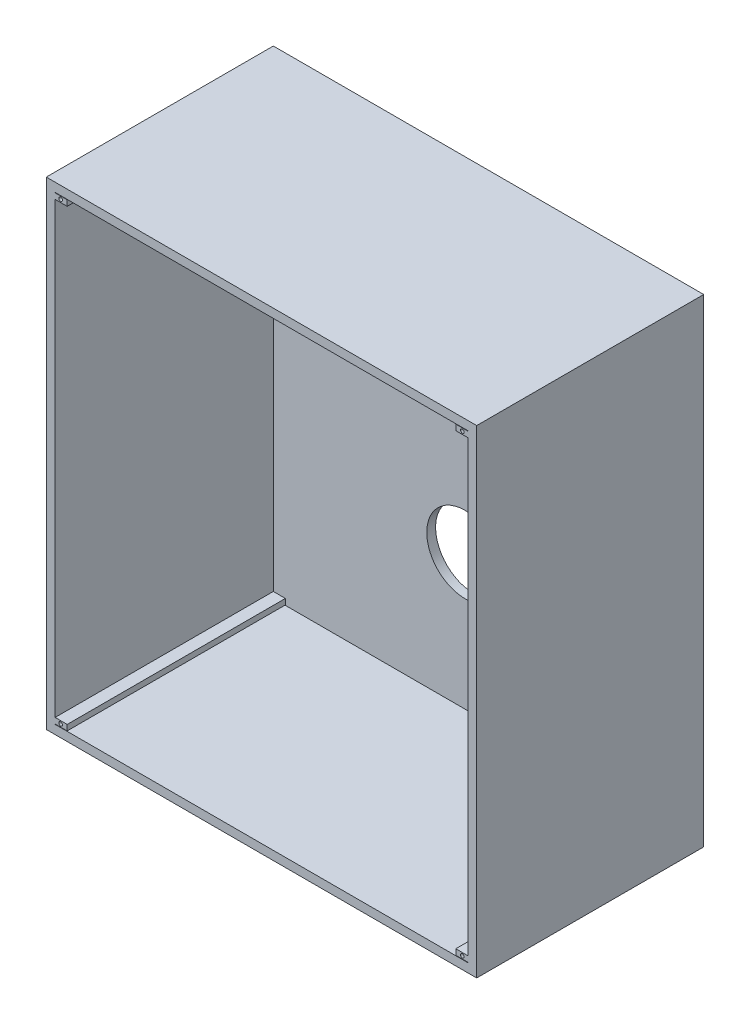
ISO-10303-21;
HEADER;
FILE_DESCRIPTION(('STEP AP214'),'2;1');
FILE_NAME('part.step','',(''),(''),'','','');
FILE_SCHEMA(('AUTOMOTIVE_DESIGN { 1 0 10303 214 1 1 1 1 }'));
ENDSEC;
DATA;
#1=APPLICATION_CONTEXT('core data for automotive mechanical design processes');
#2=APPLICATION_PROTOCOL_DEFINITION('international standard','automotive_design',2000,#1);
#3=PRODUCT_CONTEXT('',#1,'mechanical');
#4=PRODUCT('Part','Part','',(#3));
#5=PRODUCT_RELATED_PRODUCT_CATEGORY('part','',(#4));
#6=PRODUCT_DEFINITION_FORMATION('','',#4);
#7=PRODUCT_DEFINITION_CONTEXT('part definition',#1,'design');
#8=PRODUCT_DEFINITION('design','',#6,#7);
#9=PRODUCT_DEFINITION_SHAPE('','',#8);
#10=(LENGTH_UNIT() NAMED_UNIT(*) SI_UNIT(.MILLI.,.METRE.));
#11=(NAMED_UNIT(*) PLANE_ANGLE_UNIT() SI_UNIT($,.RADIAN.));
#12=(NAMED_UNIT(*) SI_UNIT($,.STERADIAN.) SOLID_ANGLE_UNIT());
#13=UNCERTAINTY_MEASURE_WITH_UNIT(LENGTH_MEASURE(1.E-05),#10,'distance_accuracy_value','');
#14=(GEOMETRIC_REPRESENTATION_CONTEXT(3) GLOBAL_UNCERTAINTY_ASSIGNED_CONTEXT((#13)) GLOBAL_UNIT_ASSIGNED_CONTEXT((#10,
#11,#12)) REPRESENTATION_CONTEXT('',''));
#15=CARTESIAN_POINT('',(0.,0.,0.));
#16=DIRECTION('',(0.,0.,1.));
#17=DIRECTION('',(1.,0.,0.));
#18=AXIS2_PLACEMENT_3D('',#15,#16,#17);
#19=CARTESIAN_POINT('',(-61.8096556008712,137.414,-30.0630808080808));
#20=DIRECTION('',(0.,0.,1.));
#21=DIRECTION('',(1.,0.,0.));
#22=AXIS2_PLACEMENT_3D('',#19,#20,#21);
#23=PLANE('',#22);
#24=CARTESIAN_POINT('',(42.9825482841144,126.151721484973,-30.0630808080808));
#25=DIRECTION('',(0.,0.,1.));
#26=DIRECTION('',(1.,0.,0.));
#27=AXIS2_PLACEMENT_3D('',#24,#25,#26);
#28=CIRCLE('',#27,3.21658595053117);
#29=CARTESIAN_POINT('',(46.1991342346456,126.151721484973,-30.0630808080808));
#30=VERTEX_POINT('',#29);
#31=EDGE_CURVE('E43',#30,#30,#28,.T.);
#32=ORIENTED_EDGE('',*,*,#31,.F.);
#33=EDGE_LOOP('',(#32));
#34=FACE_BOUND('',#33,.T.);
#35=CARTESIAN_POINT('',(17.6939437485358,108.296189209053,-30.0630808080808));
#36=DIRECTION('',(0.,0.,1.));
#37=DIRECTION('',(1.,0.,0.));
#38=AXIS2_PLACEMENT_3D('',#35,#36,#37);
#39=CIRCLE('',#38,6.6942325966102);
#40=CARTESIAN_POINT('',(24.388176345146,108.296189209053,-30.0630808080808));
#41=VERTEX_POINT('',#40);
#42=EDGE_CURVE('E482',#41,#41,#39,.T.);
#43=ORIENTED_EDGE('',*,*,#42,.F.);
#44=EDGE_LOOP('',(#43));
#45=FACE_BOUND('',#44,.T.);
#46=CARTESIAN_POINT('',(-4.2013017119811,96.4194324463372,-30.0630808080808));
#47=DIRECTION('',(0.,0.,1.));
#48=DIRECTION('',(1.,0.,0.));
#49=AXIS2_PLACEMENT_3D('',#46,#47,#48);
#50=CIRCLE('',#49,10.9927714384831);
#51=CARTESIAN_POINT('',(6.791469726502,96.4194324463372,-30.0630808080808));
#52=VERTEX_POINT('',#51);
#53=EDGE_CURVE('E479',#52,#52,#50,.T.);
#54=ORIENTED_EDGE('',*,*,#53,.F.);
#55=EDGE_LOOP('',(#54));
#56=FACE_BOUND('',#55,.T.);
#57=CARTESIAN_POINT('',(-4.2013017119811,40.9945675536628,-30.0630808080808));
#58=DIRECTION('',(0.,0.,1.));
#59=DIRECTION('',(1.,0.,0.));
#60=AXIS2_PLACEMENT_3D('',#57,#58,#59);
#61=CIRCLE('',#60,10.9927714384831);
#62=CARTESIAN_POINT('',(6.791469726502,40.9945675536628,-30.0630808080808));
#63=VERTEX_POINT('',#62);
#64=EDGE_CURVE('E475',#63,#63,#61,.T.);
#65=ORIENTED_EDGE('',*,*,#64,.F.);
#66=EDGE_LOOP('',(#65));
#67=FACE_BOUND('',#66,.T.);
#68=CARTESIAN_POINT('',(17.6939437485358,29.117810790947,-30.0630808080808));
#69=DIRECTION('',(0.,0.,1.));
#70=DIRECTION('',(1.,0.,0.));
#71=AXIS2_PLACEMENT_3D('',#68,#69,#70);
#72=CIRCLE('',#71,6.6942325966102);
#73=CARTESIAN_POINT('',(24.388176345146,29.117810790947,-30.0630808080808));
#74=VERTEX_POINT('',#73);
#75=EDGE_CURVE('E471',#74,#74,#72,.T.);
#76=ORIENTED_EDGE('',*,*,#75,.F.);
#77=EDGE_LOOP('',(#76));
#78=FACE_BOUND('',#77,.T.);
#79=CARTESIAN_POINT('',(42.9825482841144,11.2622785150273,-30.0630808080808));
#80=DIRECTION('',(0.,0.,1.));
#81=DIRECTION('',(1.,0.,0.));
#82=AXIS2_PLACEMENT_3D('',#79,#80,#81);
#83=CIRCLE('',#82,3.21658595053117);
#84=CARTESIAN_POINT('',(46.1991342346456,11.2622785150273,-30.0630808080808));
#85=VERTEX_POINT('',#84);
#86=EDGE_CURVE('E358',#85,#85,#83,.T.);
#87=ORIENTED_EDGE('',*,*,#86,.F.);
#88=EDGE_LOOP('',(#87));
#89=FACE_BOUND('',#88,.T.);
#90=DIRECTION('',(0.,-1.,0.));
#91=VECTOR('',#90,1.);
#92=CARTESIAN_POINT('',(55.806196415959,2.65184158082846,-30.0630808080808));
#93=LINE('',#92,#91);
#94=CARTESIAN_POINT('',(55.806196415959,4.27424515264677,-30.0630808080808));
#95=VERTEX_POINT('',#94);
#96=CARTESIAN_POINT('',(55.806196415959,2.65184158082846,-30.0630808080808));
#97=VERTEX_POINT('',#96);
#98=EDGE_CURVE('E214',#95,#97,#93,.T.);
#99=ORIENTED_EDGE('',*,*,#98,.F.);
#100=DIRECTION('',(-1.,0.,0.));
#101=VECTOR('',#100,1.);
#102=CARTESIAN_POINT('',(55.806196415959,4.27424515264677,-30.0630808080808));
#103=LINE('',#102,#101);
#104=CARTESIAN_POINT('',(59.2696556008712,4.27424515264677,-30.0630808080808));
#105=VERTEX_POINT('',#104);
#106=EDGE_CURVE('E227',#105,#95,#103,.T.);
#107=ORIENTED_EDGE('',*,*,#106,.F.);
#108=DIRECTION('',(0.,-1.,0.));
#109=VECTOR('',#108,1.);
#110=CARTESIAN_POINT('',(59.2696556008712,137.414,-30.0630808080808));
#111=LINE('',#110,#109);
#112=CARTESIAN_POINT('',(59.2696556008712,133.139754847353,-30.0630808080808));
#113=VERTEX_POINT('',#112);
#114=EDGE_CURVE('E388',#113,#105,#111,.T.);
#115=ORIENTED_EDGE('',*,*,#114,.F.);
#116=DIRECTION('',(1.,0.,0.));
#117=VECTOR('',#116,1.);
#118=CARTESIAN_POINT('',(55.806196415959,133.139754847353,-30.0630808080808));
#119=LINE('',#118,#117);
#120=CARTESIAN_POINT('',(55.806196415959,133.139754847353,-30.0630808080808));
#121=VERTEX_POINT('',#120);
#122=EDGE_CURVE('E335',#121,#113,#119,.T.);
#123=ORIENTED_EDGE('',*,*,#122,.F.);
#124=DIRECTION('',(0.,-1.,0.));
#125=VECTOR('',#124,1.);
#126=CARTESIAN_POINT('',(55.806196415959,134.762158419172,-30.0630808080808));
#127=LINE('',#126,#125);
#128=CARTESIAN_POINT('',(55.806196415959,134.762158419172,-30.0630808080808));
#129=VERTEX_POINT('',#128);
#130=EDGE_CURVE('E331',#129,#121,#127,.T.);
#131=ORIENTED_EDGE('',*,*,#130,.F.);
#132=DIRECTION('',(-1.,0.,0.));
#133=VECTOR('',#132,1.);
#134=CARTESIAN_POINT('',(55.806196415959,134.762158419172,-30.0630808080808));
#135=LINE('',#134,#133);
#136=CARTESIAN_POINT('',(59.2696556008712,134.762158419172,-30.0630808080808));
#137=VERTEX_POINT('',#136);
#138=EDGE_CURVE('E289',#137,#129,#135,.T.);
#139=ORIENTED_EDGE('',*,*,#138,.F.);
#140=CARTESIAN_POINT('',(59.2696556008712,134.874,-30.0630808080808));
#141=VERTEX_POINT('',#140);
#142=EDGE_CURVE('E383',#141,#137,#111,.T.);
#143=ORIENTED_EDGE('',*,*,#142,.F.);
#144=DIRECTION('',(-1.,0.,0.));
#145=VECTOR('',#144,1.);
#146=CARTESIAN_POINT('',(-61.8096556008712,134.874,-30.0630808080808));
#147=LINE('',#146,#145);
#148=CARTESIAN_POINT('',(-59.2696556008712,134.874,-30.0630808080808));
#149=VERTEX_POINT('',#148);
#150=EDGE_CURVE('E393',#141,#149,#147,.T.);
#151=ORIENTED_EDGE('',*,*,#150,.T.);
#152=DIRECTION('',(0.,-1.,0.));
#153=VECTOR('',#152,1.);
#154=CARTESIAN_POINT('',(-59.2696556008712,137.414,-30.0630808080808));
#155=LINE('',#154,#153);
#156=CARTESIAN_POINT('',(-59.2696556008712,134.762158419172,-30.0630808080808));
#157=VERTEX_POINT('',#156);
#158=EDGE_CURVE('E399',#149,#157,#155,.T.);
#159=ORIENTED_EDGE('',*,*,#158,.T.);
#160=DIRECTION('',(-1.,0.,0.));
#161=VECTOR('',#160,1.);
#162=CARTESIAN_POINT('',(-55.806196415959,134.762158419172,-30.0630808080808));
#163=LINE('',#162,#161);
#164=CARTESIAN_POINT('',(-55.806196415959,134.762158419172,-30.0630808080808));
#165=VERTEX_POINT('',#164);
#166=EDGE_CURVE('E293',#165,#157,#163,.T.);
#167=ORIENTED_EDGE('',*,*,#166,.F.);
#168=DIRECTION('',(0.,1.,0.));
#169=VECTOR('',#168,1.);
#170=CARTESIAN_POINT('',(-55.806196415959,134.762158419172,-30.0630808080808));
#171=LINE('',#170,#169);
#172=CARTESIAN_POINT('',(-55.806196415959,133.139754847353,-30.0630808080808));
#173=VERTEX_POINT('',#172);
#174=EDGE_CURVE('E251',#173,#165,#171,.T.);
#175=ORIENTED_EDGE('',*,*,#174,.F.);
#176=DIRECTION('',(1.,0.,0.));
#177=VECTOR('',#176,1.);
#178=CARTESIAN_POINT('',(-55.806196415959,133.139754847353,-30.0630808080808));
#179=LINE('',#178,#177);
#180=CARTESIAN_POINT('',(-59.2696556008712,133.139754847353,-30.0630808080808));
#181=VERTEX_POINT('',#180);
#182=EDGE_CURVE('E297',#181,#173,#179,.T.);
#183=ORIENTED_EDGE('',*,*,#182,.F.);
#184=CARTESIAN_POINT('',(-59.2696556008712,4.27424515264674,-30.0630808080808));
#185=VERTEX_POINT('',#184);
#186=EDGE_CURVE('E403',#181,#185,#155,.T.);
#187=ORIENTED_EDGE('',*,*,#186,.T.);
#188=DIRECTION('',(-1.,0.,0.));
#189=VECTOR('',#188,1.);
#190=CARTESIAN_POINT('',(-55.8061964159589,4.27424515264674,-30.0630808080808));
#191=LINE('',#190,#189);
#192=CARTESIAN_POINT('',(-55.8061964159589,4.27424515264674,-30.0630808080808));
#193=VERTEX_POINT('',#192);
#194=EDGE_CURVE('E254',#193,#185,#191,.T.);
#195=ORIENTED_EDGE('',*,*,#194,.F.);
#196=DIRECTION('',(0.,1.,0.));
#197=VECTOR('',#196,1.);
#198=CARTESIAN_POINT('',(-55.8061964159589,2.65184158082843,-30.0630808080808));
#199=LINE('',#198,#197);
#200=CARTESIAN_POINT('',(-55.8061964159589,2.65184158082843,-30.0630808080808));
#201=VERTEX_POINT('',#200);
#202=EDGE_CURVE('E65',#201,#193,#199,.T.);
#203=ORIENTED_EDGE('',*,*,#202,.F.);
#204=DIRECTION('',(1.,0.,0.));
#205=VECTOR('',#204,1.);
#206=CARTESIAN_POINT('',(-55.8061964159589,2.65184158082843,-30.0630808080808));
#207=LINE('',#206,#205);
#208=CARTESIAN_POINT('',(-59.2696556008712,2.65184158082843,-30.0630808080808));
#209=VERTEX_POINT('',#208);
#210=EDGE_CURVE('E259',#209,#201,#207,.T.);
#211=ORIENTED_EDGE('',*,*,#210,.F.);
#212=CARTESIAN_POINT('',(-59.2696556008712,2.54,-30.0630808080808));
#213=VERTEX_POINT('',#212);
#214=EDGE_CURVE('E404',#209,#213,#155,.T.);
#215=ORIENTED_EDGE('',*,*,#214,.T.);
#216=DIRECTION('',(-1.,0.,0.));
#217=VECTOR('',#216,1.);
#218=CARTESIAN_POINT('',(-61.8096556008712,2.53999999999999,-30.0630808080808));
#219=LINE('',#218,#217);
#220=CARTESIAN_POINT('',(59.2696556008712,2.54,-30.0630808080808));
#221=VERTEX_POINT('',#220);
#222=EDGE_CURVE('E382',#221,#213,#219,.T.);
#223=ORIENTED_EDGE('',*,*,#222,.F.);
#224=CARTESIAN_POINT('',(59.2696556008712,2.65184158082846,-30.0630808080808));
#225=VERTEX_POINT('',#224);
#226=EDGE_CURVE('E225',#225,#221,#111,.T.);
#227=ORIENTED_EDGE('',*,*,#226,.F.);
#228=DIRECTION('',(1.,0.,0.));
#229=VECTOR('',#228,1.);
#230=CARTESIAN_POINT('',(55.806196415959,2.65184158082846,-30.0630808080808));
#231=LINE('',#230,#229);
#232=EDGE_CURVE('E206',#97,#225,#231,.T.);
#233=ORIENTED_EDGE('',*,*,#232,.F.);
#234=EDGE_LOOP('',(#99,#107,#115,#123,#131,#139,#143,#151,#159,#167,#175,#183,#187,#195,#203,
#211,#215,#223,#227,#233));
#235=FACE_BOUND('',#234,.T.);
#236=ADVANCED_FACE('F39',(#34,#45,#56,#67,#78,#89,#235),#23,.T.);
#237=CARTESIAN_POINT('',(59.2696556008712,137.414,-32.6030808080808));
#238=DIRECTION('',(-1.,0.,0.));
#239=DIRECTION('',(0.,0.,1.));
#240=AXIS2_PLACEMENT_3D('',#237,#238,#239);
#241=PLANE('',#240);
#242=ORIENTED_EDGE('',*,*,#114,.T.);
#243=DIRECTION('',(0.,0.,-1.));
#244=VECTOR('',#243,1.);
#245=CARTESIAN_POINT('',(59.2696556008712,4.27424515264677,36.4277040412113));
#246=LINE('',#245,#244);
#247=CARTESIAN_POINT('',(59.2696556008712,4.27424515264677,32.6030808080808));
#248=VERTEX_POINT('',#247);
#249=EDGE_CURVE('E235',#248,#105,#246,.T.);
#250=ORIENTED_EDGE('',*,*,#249,.F.);
#251=DIRECTION('',(0.,-1.,0.));
#252=VECTOR('',#251,1.);
#253=CARTESIAN_POINT('',(59.2696556008712,137.414,32.6030808080808));
#254=LINE('',#253,#252);
#255=CARTESIAN_POINT('',(59.2696556008712,133.139754847353,32.6030808080808));
#256=VERTEX_POINT('',#255);
#257=EDGE_CURVE('E420',#256,#248,#254,.T.);
#258=ORIENTED_EDGE('',*,*,#257,.F.);
#259=DIRECTION('',(0.,0.,-1.));
#260=VECTOR('',#259,1.);
#261=CARTESIAN_POINT('',(59.2696556008712,133.139754847353,36.4277040412113));
#262=LINE('',#261,#260);
#263=EDGE_CURVE('E338',#256,#113,#262,.T.);
#264=ORIENTED_EDGE('',*,*,#263,.T.);
#265=EDGE_LOOP('',(#242,#250,#258,#264));
#266=FACE_BOUND('',#265,.T.);
#267=ADVANCED_FACE('F496',(#266),#241,.T.);
#268=CARTESIAN_POINT('',(59.2696556008712,2.65184158082846,32.6030808080808));
#269=VERTEX_POINT('',#268);
#270=CARTESIAN_POINT('',(59.2696556008712,2.54,32.6030808080808));
#271=VERTEX_POINT('',#270);
#272=EDGE_CURVE('E421',#269,#271,#254,.T.);
#273=ORIENTED_EDGE('',*,*,#272,.F.);
#274=DIRECTION('',(0.,0.,-1.));
#275=VECTOR('',#274,1.);
#276=CARTESIAN_POINT('',(59.2696556008712,2.65184158082846,36.4277040412113));
#277=LINE('',#276,#275);
#278=EDGE_CURVE('E57',#269,#225,#277,.T.);
#279=ORIENTED_EDGE('',*,*,#278,.T.);
#280=ORIENTED_EDGE('',*,*,#226,.T.);
#281=DIRECTION('',(0.,0.,-1.));
#282=VECTOR('',#281,1.);
#283=CARTESIAN_POINT('',(59.2696556008712,2.53999999999999,-32.6030808080808));
#284=LINE('',#283,#282);
#285=EDGE_CURVE('E378',#271,#221,#284,.T.);
#286=ORIENTED_EDGE('',*,*,#285,.F.);
#287=EDGE_LOOP('',(#273,#279,#280,#286));
#288=FACE_BOUND('',#287,.T.);
#289=ADVANCED_FACE('F561',(#288),#241,.T.);
#290=CARTESIAN_POINT('',(-59.2696556008712,137.414,-32.6030808080808));
#291=DIRECTION('',(1.,0.,0.));
#292=DIRECTION('',(0.,0.,-1.));
#293=AXIS2_PLACEMENT_3D('',#290,#291,#292);
#294=PLANE('',#293);
#295=ORIENTED_EDGE('',*,*,#214,.F.);
#296=DIRECTION('',(0.,0.,-1.));
#297=VECTOR('',#296,1.);
#298=CARTESIAN_POINT('',(-59.2696556008711,2.65184158082843,36.4277040412113));
#299=LINE('',#298,#297);
#300=CARTESIAN_POINT('',(-59.2696556008711,2.65184158082843,32.6030808080808));
#301=VERTEX_POINT('',#300);
#302=EDGE_CURVE('E266',#301,#209,#299,.T.);
#303=ORIENTED_EDGE('',*,*,#302,.F.);
#304=DIRECTION('',(0.,-1.,0.));
#305=VECTOR('',#304,1.);
#306=CARTESIAN_POINT('',(-59.2696556008712,137.414,32.6030808080808));
#307=LINE('',#306,#305);
#308=CARTESIAN_POINT('',(-59.2696556008712,2.54,32.6030808080808));
#309=VERTEX_POINT('',#308);
#310=EDGE_CURVE('E419',#301,#309,#307,.T.);
#311=ORIENTED_EDGE('',*,*,#310,.T.);
#312=DIRECTION('',(0.,0.,1.));
#313=VECTOR('',#312,1.);
#314=CARTESIAN_POINT('',(-59.2696556008712,2.53999999999999,-32.6030808080808));
#315=LINE('',#314,#313);
#316=EDGE_CURVE('E398',#213,#309,#315,.T.);
#317=ORIENTED_EDGE('',*,*,#316,.F.);
#318=EDGE_LOOP('',(#295,#303,#311,#317));
#319=FACE_BOUND('',#318,.T.);
#320=ADVANCED_FACE('F652',(#319),#294,.T.);
#321=CARTESIAN_POINT('',(-59.2696556008712,133.139754847353,32.6030808080808));
#322=VERTEX_POINT('',#321);
#323=CARTESIAN_POINT('',(-59.2696556008712,4.27424515264674,32.6030808080808));
#324=VERTEX_POINT('',#323);
#325=EDGE_CURVE('E428',#322,#324,#307,.T.);
#326=ORIENTED_EDGE('',*,*,#325,.T.);
#327=DIRECTION('',(0.,0.,-1.));
#328=VECTOR('',#327,1.);
#329=CARTESIAN_POINT('',(-59.2696556008711,4.27424515264674,36.4277040412113));
#330=LINE('',#329,#328);
#331=EDGE_CURVE('E270',#324,#185,#330,.T.);
#332=ORIENTED_EDGE('',*,*,#331,.T.);
#333=ORIENTED_EDGE('',*,*,#186,.F.);
#334=DIRECTION('',(0.,0.,-1.));
#335=VECTOR('',#334,1.);
#336=CARTESIAN_POINT('',(-59.2696556008712,133.139754847353,36.4277040412113));
#337=LINE('',#336,#335);
#338=EDGE_CURVE('E305',#322,#181,#337,.T.);
#339=ORIENTED_EDGE('',*,*,#338,.F.);
#340=EDGE_LOOP('',(#326,#332,#333,#339));
#341=FACE_BOUND('',#340,.T.);
#342=ADVANCED_FACE('F644',(#341),#294,.T.);
#343=CARTESIAN_POINT('',(-59.2696556008712,134.874,32.6030808080808));
#344=VERTEX_POINT('',#343);
#345=CARTESIAN_POINT('',(-59.2696556008712,134.762158419172,32.6030808080808));
#346=VERTEX_POINT('',#345);
#347=EDGE_CURVE('E425',#344,#346,#307,.T.);
#348=ORIENTED_EDGE('',*,*,#347,.T.);
#349=DIRECTION('',(0.,0.,-1.));
#350=VECTOR('',#349,1.);
#351=CARTESIAN_POINT('',(-59.2696556008712,134.762158419172,36.4277040412113));
#352=LINE('',#351,#350);
#353=EDGE_CURVE('E309',#346,#157,#352,.T.);
#354=ORIENTED_EDGE('',*,*,#353,.T.);
#355=ORIENTED_EDGE('',*,*,#158,.F.);
#356=DIRECTION('',(0.,0.,1.));
#357=VECTOR('',#356,1.);
#358=CARTESIAN_POINT('',(-59.2696556008712,134.874,-32.6030808080808));
#359=LINE('',#358,#357);
#360=EDGE_CURVE('E407',#149,#344,#359,.T.);
#361=ORIENTED_EDGE('',*,*,#360,.T.);
#362=EDGE_LOOP('',(#348,#354,#355,#361));
#363=FACE_BOUND('',#362,.T.);
#364=ADVANCED_FACE('F558',(#363),#294,.T.);
#365=ORIENTED_EDGE('',*,*,#142,.T.);
#366=DIRECTION('',(0.,0.,-1.));
#367=VECTOR('',#366,1.);
#368=CARTESIAN_POINT('',(59.2696556008712,134.762158419172,36.4277040412113));
#369=LINE('',#368,#367);
#370=CARTESIAN_POINT('',(59.2696556008712,134.762158419172,32.6030808080808));
#371=VERTEX_POINT('',#370);
#372=EDGE_CURVE('E348',#371,#137,#369,.T.);
#373=ORIENTED_EDGE('',*,*,#372,.F.);
#374=CARTESIAN_POINT('',(59.2696556008712,134.874,32.6030808080808));
#375=VERTEX_POINT('',#374);
#376=EDGE_CURVE('E415',#375,#371,#254,.T.);
#377=ORIENTED_EDGE('',*,*,#376,.F.);
#378=DIRECTION('',(0.,0.,-1.));
#379=VECTOR('',#378,1.);
#380=CARTESIAN_POINT('',(59.2696556008712,134.874,-32.6030808080808));
#381=LINE('',#380,#379);
#382=EDGE_CURVE('E389',#375,#141,#381,.T.);
#383=ORIENTED_EDGE('',*,*,#382,.T.);
#384=EDGE_LOOP('',(#365,#373,#377,#383));
#385=FACE_BOUND('',#384,.T.);
#386=ADVANCED_FACE('F552',(#385),#241,.T.);
#387=CARTESIAN_POINT('',(-61.8096556008712,137.414,32.6030808080808));
#388=DIRECTION('',(0.,0.,-1.));
#389=DIRECTION('',(-1.,0.,0.));
#390=AXIS2_PLACEMENT_3D('',#387,#388,#389);
#391=PLANE('',#390);
#392=CARTESIAN_POINT('',(-57.6942175466361,133.960377278148,32.6030808080808));
#393=DIRECTION('',(0.,0.,1.));
#394=DIRECTION('',(-1.,0.,0.));
#395=AXIS2_PLACEMENT_3D('',#392,#393,#394);
#396=CIRCLE('',#395,0.525209505554776);
#397=CARTESIAN_POINT('',(-58.2194270521909,133.960377278148,32.6030808080808));
#398=VERTEX_POINT('',#397);
#399=EDGE_CURVE('E565',#398,#398,#396,.T.);
#400=ORIENTED_EDGE('',*,*,#399,.F.);
#401=EDGE_LOOP('',(#400));
#402=FACE_BOUND('',#401,.T.);
#403=CARTESIAN_POINT('',(57.6942175466361,3.45362272185212,32.6030808080808));
#404=DIRECTION('',(0.,0.,1.));
#405=DIRECTION('',(-1.,0.,0.));
#406=AXIS2_PLACEMENT_3D('',#403,#404,#405);
#407=CIRCLE('',#406,0.525209505554776);
#408=CARTESIAN_POINT('',(57.1690080410814,3.45362272185212,32.6030808080808));
#409=VERTEX_POINT('',#408);
#410=EDGE_CURVE('E569',#409,#409,#407,.T.);
#411=ORIENTED_EDGE('',*,*,#410,.F.);
#412=EDGE_LOOP('',(#411));
#413=FACE_BOUND('',#412,.T.);
#414=CARTESIAN_POINT('',(-57.6942175466361,3.45362272185212,32.6030808080808));
#415=DIRECTION('',(0.,0.,1.));
#416=DIRECTION('',(1.,0.,0.));
#417=AXIS2_PLACEMENT_3D('',#414,#415,#416);
#418=CIRCLE('',#417,0.525209505554776);
#419=CARTESIAN_POINT('',(-57.1690080410814,3.45362272185212,32.6030808080808));
#420=VERTEX_POINT('',#419);
#421=EDGE_CURVE('E573',#420,#420,#418,.T.);
#422=ORIENTED_EDGE('',*,*,#421,.F.);
#423=EDGE_LOOP('',(#422));
#424=FACE_BOUND('',#423,.T.);
#425=CARTESIAN_POINT('',(57.6942175466361,133.960377278148,32.6030808080808));
#426=DIRECTION('',(0.,0.,1.));
#427=DIRECTION('',(1.,0.,0.));
#428=AXIS2_PLACEMENT_3D('',#425,#426,#427);
#429=CIRCLE('',#428,0.525209505554776);
#430=CARTESIAN_POINT('',(58.2194270521909,133.960377278148,32.6030808080808));
#431=VERTEX_POINT('',#430);
#432=EDGE_CURVE('E576',#431,#431,#429,.T.);
#433=ORIENTED_EDGE('',*,*,#432,.F.);
#434=EDGE_LOOP('',(#433));
#435=FACE_BOUND('',#434,.T.);
#436=DIRECTION('',(1.,0.,0.));
#437=VECTOR('',#436,1.);
#438=CARTESIAN_POINT('',(-61.8096556008712,0.,32.6030808080808));
#439=LINE('',#438,#437);
#440=CARTESIAN_POINT('',(-61.8096556008712,0.,32.6030808080808));
#441=VERTEX_POINT('',#440);
#442=CARTESIAN_POINT('',(61.8096556008712,0.,32.6030808080808));
#443=VERTEX_POINT('',#442);
#444=EDGE_CURVE('E437',#441,#443,#439,.T.);
#445=ORIENTED_EDGE('',*,*,#444,.T.);
#446=DIRECTION('',(0.,-1.,0.));
#447=VECTOR('',#446,1.);
#448=CARTESIAN_POINT('',(61.8096556008712,137.414,32.6030808080808));
#449=LINE('',#448,#447);
#450=CARTESIAN_POINT('',(61.8096556008712,137.414,32.6030808080808));
#451=VERTEX_POINT('',#450);
#452=EDGE_CURVE('E446',#451,#443,#449,.T.);
#453=ORIENTED_EDGE('',*,*,#452,.F.);
#454=DIRECTION('',(1.,0.,0.));
#455=VECTOR('',#454,1.);
#456=CARTESIAN_POINT('',(-61.8096556008712,137.414,32.6030808080808));
#457=LINE('',#456,#455);
#458=CARTESIAN_POINT('',(-61.8096556008712,137.414,32.6030808080808));
#459=VERTEX_POINT('',#458);
#460=EDGE_CURVE('E443',#459,#451,#457,.T.);
#461=ORIENTED_EDGE('',*,*,#460,.F.);
#462=DIRECTION('',(0.,-1.,0.));
#463=VECTOR('',#462,1.);
#464=CARTESIAN_POINT('',(-61.8096556008712,137.414,32.6030808080808));
#465=LINE('',#464,#463);
#466=EDGE_CURVE('E461',#459,#441,#465,.T.);
#467=ORIENTED_EDGE('',*,*,#466,.T.);
#468=EDGE_LOOP('',(#445,#453,#461,#467));
#469=FACE_BOUND('',#468,.T.);
#470=DIRECTION('',(1.,0.,0.));
#471=VECTOR('',#470,1.);
#472=CARTESIAN_POINT('',(-61.8096556008712,2.53999999999999,32.6030808080808));
#473=LINE('',#472,#471);
#474=EDGE_CURVE('E394',#309,#271,#473,.T.);
#475=ORIENTED_EDGE('',*,*,#474,.F.);
#476=ORIENTED_EDGE('',*,*,#310,.F.);
#477=DIRECTION('',(-1.,0.,0.));
#478=VECTOR('',#477,1.);
#479=CARTESIAN_POINT('',(-55.8061964159589,2.65184158082843,32.6030808080808));
#480=LINE('',#479,#478);
#481=CARTESIAN_POINT('',(-55.8061964159589,2.65184158082843,32.6030808080808));
#482=VERTEX_POINT('',#481);
#483=EDGE_CURVE('E247',#482,#301,#480,.T.);
#484=ORIENTED_EDGE('',*,*,#483,.F.);
#485=DIRECTION('',(0.,-1.,0.));
#486=VECTOR('',#485,1.);
#487=CARTESIAN_POINT('',(-55.8061964159589,2.65184158082843,32.6030808080808));
#488=LINE('',#487,#486);
#489=CARTESIAN_POINT('',(-55.8061964159589,4.27424515264674,32.6030808080808));
#490=VERTEX_POINT('',#489);
#491=EDGE_CURVE('E246',#490,#482,#488,.T.);
#492=ORIENTED_EDGE('',*,*,#491,.F.);
#493=DIRECTION('',(1.,0.,0.));
#494=VECTOR('',#493,1.);
#495=CARTESIAN_POINT('',(-55.8061964159589,4.27424515264674,32.6030808080808));
#496=LINE('',#495,#494);
#497=EDGE_CURVE('E242',#324,#490,#496,.T.);
#498=ORIENTED_EDGE('',*,*,#497,.F.);
#499=ORIENTED_EDGE('',*,*,#325,.F.);
#500=DIRECTION('',(-1.,0.,0.));
#501=VECTOR('',#500,1.);
#502=CARTESIAN_POINT('',(-55.806196415959,133.139754847353,32.6030808080808));
#503=LINE('',#502,#501);
#504=CARTESIAN_POINT('',(-55.806196415959,133.139754847353,32.6030808080808));
#505=VERTEX_POINT('',#504);
#506=EDGE_CURVE('E285',#505,#322,#503,.T.);
#507=ORIENTED_EDGE('',*,*,#506,.F.);
#508=DIRECTION('',(0.,-1.,0.));
#509=VECTOR('',#508,1.);
#510=CARTESIAN_POINT('',(-55.806196415959,134.762158419172,32.6030808080808));
#511=LINE('',#510,#509);
#512=CARTESIAN_POINT('',(-55.806196415959,134.762158419172,32.6030808080808));
#513=VERTEX_POINT('',#512);
#514=EDGE_CURVE('E284',#513,#505,#511,.T.);
#515=ORIENTED_EDGE('',*,*,#514,.F.);
#516=DIRECTION('',(1.,0.,0.));
#517=VECTOR('',#516,1.);
#518=CARTESIAN_POINT('',(-55.806196415959,134.762158419172,32.6030808080808));
#519=LINE('',#518,#517);
#520=EDGE_CURVE('E280',#346,#513,#519,.T.);
#521=ORIENTED_EDGE('',*,*,#520,.F.);
#522=ORIENTED_EDGE('',*,*,#347,.F.);
#523=DIRECTION('',(1.,0.,0.));
#524=VECTOR('',#523,1.);
#525=CARTESIAN_POINT('',(-61.8096556008712,134.874,32.6030808080808));
#526=LINE('',#525,#524);
#527=EDGE_CURVE('E414',#344,#375,#526,.T.);
#528=ORIENTED_EDGE('',*,*,#527,.T.);
#529=ORIENTED_EDGE('',*,*,#376,.T.);
#530=DIRECTION('',(1.,0.,0.));
#531=VECTOR('',#530,1.);
#532=CARTESIAN_POINT('',(55.806196415959,134.762158419172,32.6030808080808));
#533=LINE('',#532,#531);
#534=CARTESIAN_POINT('',(55.806196415959,134.762158419172,32.6030808080808));
#535=VERTEX_POINT('',#534);
#536=EDGE_CURVE('E323',#535,#371,#533,.T.);
#537=ORIENTED_EDGE('',*,*,#536,.F.);
#538=DIRECTION('',(0.,1.,0.));
#539=VECTOR('',#538,1.);
#540=CARTESIAN_POINT('',(55.806196415959,134.762158419172,32.6030808080808));
#541=LINE('',#540,#539);
#542=CARTESIAN_POINT('',(55.806196415959,133.139754847353,32.6030808080808));
#543=VERTEX_POINT('',#542);
#544=EDGE_CURVE('E319',#543,#535,#541,.T.);
#545=ORIENTED_EDGE('',*,*,#544,.F.);
#546=DIRECTION('',(-1.,0.,0.));
#547=VECTOR('',#546,1.);
#548=CARTESIAN_POINT('',(55.806196415959,133.139754847353,32.6030808080808));
#549=LINE('',#548,#547);
#550=EDGE_CURVE('E324',#256,#543,#549,.T.);
#551=ORIENTED_EDGE('',*,*,#550,.F.);
#552=ORIENTED_EDGE('',*,*,#257,.T.);
#553=DIRECTION('',(1.,0.,0.));
#554=VECTOR('',#553,1.);
#555=CARTESIAN_POINT('',(55.806196415959,4.27424515264677,32.6030808080808));
#556=LINE('',#555,#554);
#557=CARTESIAN_POINT('',(55.806196415959,4.27424515264677,32.6030808080808));
#558=VERTEX_POINT('',#557);
#559=EDGE_CURVE('E211',#558,#248,#556,.T.);
#560=ORIENTED_EDGE('',*,*,#559,.F.);
#561=DIRECTION('',(0.,1.,0.));
#562=VECTOR('',#561,1.);
#563=CARTESIAN_POINT('',(55.806196415959,2.65184158082846,32.6030808080808));
#564=LINE('',#563,#562);
#565=CARTESIAN_POINT('',(55.806196415959,2.65184158082846,32.6030808080808));
#566=VERTEX_POINT('',#565);
#567=EDGE_CURVE('E255',#566,#558,#564,.T.);
#568=ORIENTED_EDGE('',*,*,#567,.F.);
#569=DIRECTION('',(-1.,0.,0.));
#570=VECTOR('',#569,1.);
#571=CARTESIAN_POINT('',(55.806196415959,2.65184158082846,32.6030808080808));
#572=LINE('',#571,#570);
#573=EDGE_CURVE('E207',#269,#566,#572,.T.);
#574=ORIENTED_EDGE('',*,*,#573,.F.);
#575=ORIENTED_EDGE('',*,*,#272,.T.);
#576=EDGE_LOOP('',(#475,#476,#484,#492,#498,#499,#507,#515,#521,#522,#528,#529,#537,#545,#551,
#552,#560,#568,#574,#575));
#577=FACE_BOUND('',#576,.T.);
#578=ADVANCED_FACE('F532',(#402,#413,#424,#435,#469,#577),#391,.F.);
#579=CARTESIAN_POINT('',(61.8096556008712,137.414,-32.6030808080808));
#580=DIRECTION('',(-1.,0.,0.));
#581=DIRECTION('',(0.,0.,1.));
#582=AXIS2_PLACEMENT_3D('',#579,#580,#581);
#583=PLANE('',#582);
#584=DIRECTION('',(0.,0.,-1.));
#585=VECTOR('',#584,1.);
#586=CARTESIAN_POINT('',(61.8096556008712,0.,-32.6030808080808));
#587=LINE('',#586,#585);
#588=CARTESIAN_POINT('',(61.8096556008712,0.,-32.6030808080808));
#589=VERTEX_POINT('',#588);
#590=EDGE_CURVE('E387',#443,#589,#587,.T.);
#591=ORIENTED_EDGE('',*,*,#590,.T.);
#592=DIRECTION('',(0.,-1.,0.));
#593=VECTOR('',#592,1.);
#594=CARTESIAN_POINT('',(61.8096556008712,137.414,-32.6030808080808));
#595=LINE('',#594,#593);
#596=CARTESIAN_POINT('',(61.8096556008712,137.414,-32.6030808080808));
#597=VERTEX_POINT('',#596);
#598=EDGE_CURVE('E11',#597,#589,#595,.T.);
#599=ORIENTED_EDGE('',*,*,#598,.F.);
#600=DIRECTION('',(0.,0.,-1.));
#601=VECTOR('',#600,1.);
#602=CARTESIAN_POINT('',(61.8096556008712,137.414,-32.6030808080808));
#603=LINE('',#602,#601);
#604=EDGE_CURVE('E432',#451,#597,#603,.T.);
#605=ORIENTED_EDGE('',*,*,#604,.F.);
#606=ORIENTED_EDGE('',*,*,#452,.T.);
#607=EDGE_LOOP('',(#591,#599,#605,#606));
#608=FACE_BOUND('',#607,.T.);
#609=ADVANCED_FACE('F41',(#608),#583,.F.);
#610=CARTESIAN_POINT('',(-61.8096556008712,137.414,-32.6030808080808));
#611=DIRECTION('',(0.,0.,1.));
#612=DIRECTION('',(1.,0.,0.));
#613=AXIS2_PLACEMENT_3D('',#610,#611,#612);
#614=PLANE('',#613);
#615=CARTESIAN_POINT('',(42.9825482841144,126.151721484973,-32.6030808080808));
#616=DIRECTION('',(0.,0.,-1.));
#617=DIRECTION('',(-1.,0.,0.));
#618=AXIS2_PLACEMENT_3D('',#615,#616,#617);
#619=CIRCLE('',#618,3.21658595053117);
#620=CARTESIAN_POINT('',(39.7659623335833,126.151721484973,-32.6030808080808));
#621=VERTEX_POINT('',#620);
#622=EDGE_CURVE('E354',#621,#621,#619,.T.);
#623=ORIENTED_EDGE('',*,*,#622,.F.);
#624=EDGE_LOOP('',(#623));
#625=FACE_BOUND('',#624,.T.);
#626=CARTESIAN_POINT('',(17.6939437485358,108.296189209053,-32.6030808080808));
#627=DIRECTION('',(0.,0.,-1.));
#628=DIRECTION('',(-1.,0.,0.));
#629=AXIS2_PLACEMENT_3D('',#626,#627,#628);
#630=CIRCLE('',#629,6.6942325966102);
#631=CARTESIAN_POINT('',(10.9997111519256,108.296189209053,-32.6030808080808));
#632=VERTEX_POINT('',#631);
#633=EDGE_CURVE('E359',#632,#632,#630,.T.);
#634=ORIENTED_EDGE('',*,*,#633,.F.);
#635=EDGE_LOOP('',(#634));
#636=FACE_BOUND('',#635,.T.);
#637=CARTESIAN_POINT('',(-4.2013017119811,96.4194324463372,-32.6030808080808));
#638=DIRECTION('',(0.,0.,-1.));
#639=DIRECTION('',(-1.,0.,0.));
#640=AXIS2_PLACEMENT_3D('',#637,#638,#639);
#641=CIRCLE('',#640,10.9927714384831);
#642=CARTESIAN_POINT('',(-15.1940731504642,96.4194324463372,-32.6030808080808));
#643=VERTEX_POINT('',#642);
#644=EDGE_CURVE('E363',#643,#643,#641,.T.);
#645=ORIENTED_EDGE('',*,*,#644,.F.);
#646=EDGE_LOOP('',(#645));
#647=FACE_BOUND('',#646,.T.);
#648=CARTESIAN_POINT('',(-4.2013017119811,40.9945675536628,-32.6030808080808));
#649=DIRECTION('',(0.,0.,-1.));
#650=DIRECTION('',(1.,0.,0.));
#651=AXIS2_PLACEMENT_3D('',#648,#649,#650);
#652=CIRCLE('',#651,10.9927714384831);
#653=CARTESIAN_POINT('',(6.791469726502,40.9945675536628,-32.6030808080808));
#654=VERTEX_POINT('',#653);
#655=EDGE_CURVE('E367',#654,#654,#652,.T.);
#656=ORIENTED_EDGE('',*,*,#655,.F.);
#657=EDGE_LOOP('',(#656));
#658=FACE_BOUND('',#657,.T.);
#659=CARTESIAN_POINT('',(17.6939437485358,29.117810790947,-32.6030808080808));
#660=DIRECTION('',(0.,0.,-1.));
#661=DIRECTION('',(1.,0.,0.));
#662=AXIS2_PLACEMENT_3D('',#659,#660,#661);
#663=CIRCLE('',#662,6.6942325966102);
#664=CARTESIAN_POINT('',(24.388176345146,29.117810790947,-32.6030808080808));
#665=VERTEX_POINT('',#664);
#666=EDGE_CURVE('E371',#665,#665,#663,.T.);
#667=ORIENTED_EDGE('',*,*,#666,.F.);
#668=EDGE_LOOP('',(#667));
#669=FACE_BOUND('',#668,.T.);
#670=CARTESIAN_POINT('',(42.9825482841144,11.2622785150273,-32.6030808080808));
#671=DIRECTION('',(0.,0.,-1.));
#672=DIRECTION('',(1.,0.,0.));
#673=AXIS2_PLACEMENT_3D('',#670,#671,#672);
#674=CIRCLE('',#673,3.21658595053117);
#675=CARTESIAN_POINT('',(46.1991342346456,11.2622785150273,-32.6030808080808));
#676=VERTEX_POINT('',#675);
#677=EDGE_CURVE('E327',#676,#676,#674,.T.);
#678=ORIENTED_EDGE('',*,*,#677,.F.);
#679=EDGE_LOOP('',(#678));
#680=FACE_BOUND('',#679,.T.);
#681=DIRECTION('',(-1.,0.,0.));
#682=VECTOR('',#681,1.);
#683=CARTESIAN_POINT('',(-61.8096556008712,0.,-32.6030808080808));
#684=LINE('',#683,#682);
#685=CARTESIAN_POINT('',(-61.8096556008712,0.,-32.6030808080808));
#686=VERTEX_POINT('',#685);
#687=EDGE_CURVE('E450',#589,#686,#684,.T.);
#688=ORIENTED_EDGE('',*,*,#687,.T.);
#689=DIRECTION('',(0.,-1.,0.));
#690=VECTOR('',#689,1.);
#691=CARTESIAN_POINT('',(-61.8096556008712,137.414,-32.6030808080808));
#692=LINE('',#691,#690);
#693=CARTESIAN_POINT('',(-61.8096556008712,137.414,-32.6030808080808));
#694=VERTEX_POINT('',#693);
#695=EDGE_CURVE('E49',#694,#686,#692,.T.);
#696=ORIENTED_EDGE('',*,*,#695,.F.);
#697=DIRECTION('',(-1.,0.,0.));
#698=VECTOR('',#697,1.);
#699=CARTESIAN_POINT('',(-61.8096556008712,137.414,-32.6030808080808));
#700=LINE('',#699,#698);
#701=EDGE_CURVE('E436',#597,#694,#700,.T.);
#702=ORIENTED_EDGE('',*,*,#701,.F.);
#703=ORIENTED_EDGE('',*,*,#598,.T.);
#704=EDGE_LOOP('',(#688,#696,#702,#703));
#705=FACE_BOUND('',#704,.T.);
#706=ADVANCED_FACE('F515',(#625,#636,#647,#658,#669,#680,#705),#614,.F.);
#707=CARTESIAN_POINT('',(-61.8096556008712,137.414,-32.6030808080808));
#708=DIRECTION('',(1.,0.,0.));
#709=DIRECTION('',(0.,0.,-1.));
#710=AXIS2_PLACEMENT_3D('',#707,#708,#709);
#711=PLANE('',#710);
#712=DIRECTION('',(0.,0.,1.));
#713=VECTOR('',#712,1.);
#714=CARTESIAN_POINT('',(-61.8096556008712,0.,-32.6030808080808));
#715=LINE('',#714,#713);
#716=EDGE_CURVE('E453',#686,#441,#715,.T.);
#717=ORIENTED_EDGE('',*,*,#716,.T.);
#718=ORIENTED_EDGE('',*,*,#466,.F.);
#719=DIRECTION('',(0.,0.,1.));
#720=VECTOR('',#719,1.);
#721=CARTESIAN_POINT('',(-61.8096556008712,137.414,-32.6030808080808));
#722=LINE('',#721,#720);
#723=EDGE_CURVE('E440',#694,#459,#722,.T.);
#724=ORIENTED_EDGE('',*,*,#723,.F.);
#725=ORIENTED_EDGE('',*,*,#695,.T.);
#726=EDGE_LOOP('',(#717,#718,#724,#725));
#727=FACE_BOUND('',#726,.T.);
#728=ADVANCED_FACE('F518',(#727),#711,.F.);
#729=CARTESIAN_POINT('',(0.,137.414,0.));
#730=DIRECTION('',(0.,1.,0.));
#731=DIRECTION('',(0.,0.,1.));
#732=AXIS2_PLACEMENT_3D('',#729,#730,#731);
#733=PLANE('',#732);
#734=ORIENTED_EDGE('',*,*,#604,.T.);
#735=ORIENTED_EDGE('',*,*,#701,.T.);
#736=ORIENTED_EDGE('',*,*,#723,.T.);
#737=ORIENTED_EDGE('',*,*,#460,.T.);
#738=EDGE_LOOP('',(#734,#735,#736,#737));
#739=FACE_BOUND('',#738,.T.);
#740=ADVANCED_FACE('F538',(#739),#733,.T.);
#741=CARTESIAN_POINT('',(0.,0.,0.));
#742=DIRECTION('',(0.,1.,0.));
#743=DIRECTION('',(0.,0.,1.));
#744=AXIS2_PLACEMENT_3D('',#741,#742,#743);
#745=PLANE('',#744);
#746=ORIENTED_EDGE('',*,*,#590,.F.);
#747=ORIENTED_EDGE('',*,*,#444,.F.);
#748=ORIENTED_EDGE('',*,*,#716,.F.);
#749=ORIENTED_EDGE('',*,*,#687,.F.);
#750=EDGE_LOOP('',(#746,#747,#748,#749));
#751=FACE_BOUND('',#750,.T.);
#752=ADVANCED_FACE('F529',(#751),#745,.F.);
#753=CARTESIAN_POINT('',(0.,134.874,0.));
#754=DIRECTION('',(0.,1.,0.));
#755=DIRECTION('',(0.,0.,1.));
#756=AXIS2_PLACEMENT_3D('',#753,#754,#755);
#757=PLANE('',#756);
#758=ORIENTED_EDGE('',*,*,#382,.F.);
#759=ORIENTED_EDGE('',*,*,#527,.F.);
#760=ORIENTED_EDGE('',*,*,#360,.F.);
#761=ORIENTED_EDGE('',*,*,#150,.F.);
#762=EDGE_LOOP('',(#758,#759,#760,#761));
#763=FACE_BOUND('',#762,.T.);
#764=ADVANCED_FACE('F545',(#763),#757,.F.);
#765=CARTESIAN_POINT('',(0.,2.54,0.));
#766=DIRECTION('',(0.,1.,0.));
#767=DIRECTION('',(0.,0.,1.));
#768=AXIS2_PLACEMENT_3D('',#765,#766,#767);
#769=PLANE('',#768);
#770=ORIENTED_EDGE('',*,*,#285,.T.);
#771=ORIENTED_EDGE('',*,*,#222,.T.);
#772=ORIENTED_EDGE('',*,*,#316,.T.);
#773=ORIENTED_EDGE('',*,*,#474,.T.);
#774=EDGE_LOOP('',(#770,#771,#772,#773));
#775=FACE_BOUND('',#774,.T.);
#776=ADVANCED_FACE('F511',(#775),#769,.T.);
#777=CARTESIAN_POINT('',(42.9825482841144,11.2622785150273,104.810919191919));
#778=DIRECTION('',(0.,0.,-1.));
#779=DIRECTION('',(-1.,0.,0.));
#780=AXIS2_PLACEMENT_3D('',#777,#778,#779);
#781=CYLINDRICAL_SURFACE('',#780,3.21658595053117);
#782=ORIENTED_EDGE('',*,*,#86,.T.);
#783=EDGE_LOOP('',(#782));
#784=FACE_BOUND('',#783,.T.);
#785=ORIENTED_EDGE('',*,*,#677,.T.);
#786=EDGE_LOOP('',(#785));
#787=FACE_BOUND('',#786,.T.);
#788=ADVANCED_FACE('F507',(#784,#787),#781,.F.);
#789=CARTESIAN_POINT('',(17.6939437485358,29.117810790947,104.810919191919));
#790=DIRECTION('',(0.,0.,-1.));
#791=DIRECTION('',(-1.,0.,0.));
#792=AXIS2_PLACEMENT_3D('',#789,#790,#791);
#793=CYLINDRICAL_SURFACE('',#792,6.6942325966102);
#794=ORIENTED_EDGE('',*,*,#75,.T.);
#795=EDGE_LOOP('',(#794));
#796=FACE_BOUND('',#795,.T.);
#797=ORIENTED_EDGE('',*,*,#666,.T.);
#798=EDGE_LOOP('',(#797));
#799=FACE_BOUND('',#798,.T.);
#800=ADVANCED_FACE('F510',(#796,#799),#793,.F.);
#801=CARTESIAN_POINT('',(-4.2013017119811,40.9945675536628,104.810919191919));
#802=DIRECTION('',(0.,0.,-1.));
#803=DIRECTION('',(-1.,0.,0.));
#804=AXIS2_PLACEMENT_3D('',#801,#802,#803);
#805=CYLINDRICAL_SURFACE('',#804,10.9927714384831);
#806=ORIENTED_EDGE('',*,*,#64,.T.);
#807=EDGE_LOOP('',(#806));
#808=FACE_BOUND('',#807,.T.);
#809=ORIENTED_EDGE('',*,*,#655,.T.);
#810=EDGE_LOOP('',(#809));
#811=FACE_BOUND('',#810,.T.);
#812=ADVANCED_FACE('F691',(#808,#811),#805,.F.);
#813=CARTESIAN_POINT('',(-4.2013017119811,96.4194324463372,104.810919191919));
#814=DIRECTION('',(0.,0.,-1.));
#815=DIRECTION('',(-1.,0.,0.));
#816=AXIS2_PLACEMENT_3D('',#813,#814,#815);
#817=CYLINDRICAL_SURFACE('',#816,10.9927714384831);
#818=ORIENTED_EDGE('',*,*,#53,.T.);
#819=EDGE_LOOP('',(#818));
#820=FACE_BOUND('',#819,.T.);
#821=ORIENTED_EDGE('',*,*,#644,.T.);
#822=EDGE_LOOP('',(#821));
#823=FACE_BOUND('',#822,.T.);
#824=ADVANCED_FACE('F688',(#820,#823),#817,.F.);
#825=CARTESIAN_POINT('',(17.6939437485358,108.296189209053,104.810919191919));
#826=DIRECTION('',(0.,0.,-1.));
#827=DIRECTION('',(-1.,0.,0.));
#828=AXIS2_PLACEMENT_3D('',#825,#826,#827);
#829=CYLINDRICAL_SURFACE('',#828,6.6942325966102);
#830=ORIENTED_EDGE('',*,*,#42,.T.);
#831=EDGE_LOOP('',(#830));
#832=FACE_BOUND('',#831,.T.);
#833=ORIENTED_EDGE('',*,*,#633,.T.);
#834=EDGE_LOOP('',(#833));
#835=FACE_BOUND('',#834,.T.);
#836=ADVANCED_FACE('F685',(#832,#835),#829,.F.);
#837=CARTESIAN_POINT('',(42.9825482841144,126.151721484973,104.810919191919));
#838=DIRECTION('',(0.,0.,-1.));
#839=DIRECTION('',(-1.,0.,0.));
#840=AXIS2_PLACEMENT_3D('',#837,#838,#839);
#841=CYLINDRICAL_SURFACE('',#840,3.21658595053117);
#842=ORIENTED_EDGE('',*,*,#31,.T.);
#843=EDGE_LOOP('',(#842));
#844=FACE_BOUND('',#843,.T.);
#845=ORIENTED_EDGE('',*,*,#622,.T.);
#846=EDGE_LOOP('',(#845));
#847=FACE_BOUND('',#846,.T.);
#848=ADVANCED_FACE('F491',(#844,#847),#841,.F.);
#849=CARTESIAN_POINT('',(55.806196415959,133.139754847353,36.4277040412113));
#850=DIRECTION('',(0.,1.,0.));
#851=DIRECTION('',(0.,0.,1.));
#852=AXIS2_PLACEMENT_3D('',#849,#850,#851);
#853=PLANE('',#852);
#854=ORIENTED_EDGE('',*,*,#263,.F.);
#855=ORIENTED_EDGE('',*,*,#550,.T.);
#856=DIRECTION('',(0.,0.,-1.));
#857=VECTOR('',#856,1.);
#858=CARTESIAN_POINT('',(55.806196415959,133.139754847353,36.4277040412113));
#859=LINE('',#858,#857);
#860=EDGE_CURVE('E342',#543,#121,#859,.T.);
#861=ORIENTED_EDGE('',*,*,#860,.T.);
#862=ORIENTED_EDGE('',*,*,#122,.T.);
#863=EDGE_LOOP('',(#854,#855,#861,#862));
#864=FACE_BOUND('',#863,.T.);
#865=ADVANCED_FACE('F615',(#864),#853,.F.);
#866=CARTESIAN_POINT('',(55.806196415959,134.762158419172,36.4277040412113));
#867=DIRECTION('',(1.,0.,0.));
#868=DIRECTION('',(0.,0.,-1.));
#869=AXIS2_PLACEMENT_3D('',#866,#867,#868);
#870=PLANE('',#869);
#871=ORIENTED_EDGE('',*,*,#860,.F.);
#872=ORIENTED_EDGE('',*,*,#544,.T.);
#873=DIRECTION('',(0.,0.,-1.));
#874=VECTOR('',#873,1.);
#875=CARTESIAN_POINT('',(55.806196415959,134.762158419172,36.4277040412113));
#876=LINE('',#875,#874);
#877=EDGE_CURVE('E345',#535,#129,#876,.T.);
#878=ORIENTED_EDGE('',*,*,#877,.T.);
#879=ORIENTED_EDGE('',*,*,#130,.T.);
#880=EDGE_LOOP('',(#871,#872,#878,#879));
#881=FACE_BOUND('',#880,.T.);
#882=ADVANCED_FACE('F620',(#881),#870,.F.);
#883=CARTESIAN_POINT('',(55.806196415959,134.762158419172,36.4277040412113));
#884=DIRECTION('',(0.,-1.,0.));
#885=DIRECTION('',(0.,0.,-1.));
#886=AXIS2_PLACEMENT_3D('',#883,#884,#885);
#887=PLANE('',#886);
#888=ORIENTED_EDGE('',*,*,#877,.F.);
#889=ORIENTED_EDGE('',*,*,#536,.T.);
#890=ORIENTED_EDGE('',*,*,#372,.T.);
#891=ORIENTED_EDGE('',*,*,#138,.T.);
#892=EDGE_LOOP('',(#888,#889,#890,#891));
#893=FACE_BOUND('',#892,.T.);
#894=ADVANCED_FACE('F623',(#893),#887,.F.);
#895=CARTESIAN_POINT('',(-55.806196415959,133.139754847353,36.4277040412113));
#896=DIRECTION('',(0.,1.,0.));
#897=DIRECTION('',(0.,0.,1.));
#898=AXIS2_PLACEMENT_3D('',#895,#896,#897);
#899=PLANE('',#898);
#900=DIRECTION('',(0.,0.,-1.));
#901=VECTOR('',#900,1.);
#902=CARTESIAN_POINT('',(-55.806196415959,133.139754847353,36.4277040412113));
#903=LINE('',#902,#901);
#904=EDGE_CURVE('E301',#505,#173,#903,.T.);
#905=ORIENTED_EDGE('',*,*,#904,.F.);
#906=ORIENTED_EDGE('',*,*,#506,.T.);
#907=ORIENTED_EDGE('',*,*,#338,.T.);
#908=ORIENTED_EDGE('',*,*,#182,.T.);
#909=EDGE_LOOP('',(#905,#906,#907,#908));
#910=FACE_BOUND('',#909,.T.);
#911=ADVANCED_FACE('F647',(#910),#899,.F.);
#912=CARTESIAN_POINT('',(-55.806196415959,134.762158419172,36.4277040412113));
#913=DIRECTION('',(0.,-1.,0.));
#914=DIRECTION('',(0.,0.,-1.));
#915=AXIS2_PLACEMENT_3D('',#912,#913,#914);
#916=PLANE('',#915);
#917=ORIENTED_EDGE('',*,*,#353,.F.);
#918=ORIENTED_EDGE('',*,*,#520,.T.);
#919=DIRECTION('',(0.,0.,-1.));
#920=VECTOR('',#919,1.);
#921=CARTESIAN_POINT('',(-55.806196415959,134.762158419172,36.4277040412113));
#922=LINE('',#921,#920);
#923=EDGE_CURVE('E312',#513,#165,#922,.T.);
#924=ORIENTED_EDGE('',*,*,#923,.T.);
#925=ORIENTED_EDGE('',*,*,#166,.T.);
#926=EDGE_LOOP('',(#917,#918,#924,#925));
#927=FACE_BOUND('',#926,.T.);
#928=ADVANCED_FACE('F634',(#927),#916,.F.);
#929=CARTESIAN_POINT('',(-55.806196415959,134.762158419172,36.4277040412113));
#930=DIRECTION('',(-1.,0.,0.));
#931=DIRECTION('',(0.,0.,1.));
#932=AXIS2_PLACEMENT_3D('',#929,#930,#931);
#933=PLANE('',#932);
#934=ORIENTED_EDGE('',*,*,#923,.F.);
#935=ORIENTED_EDGE('',*,*,#514,.T.);
#936=ORIENTED_EDGE('',*,*,#904,.T.);
#937=ORIENTED_EDGE('',*,*,#174,.T.);
#938=EDGE_LOOP('',(#934,#935,#936,#937));
#939=FACE_BOUND('',#938,.T.);
#940=ADVANCED_FACE('F637',(#939),#933,.F.);
#941=CARTESIAN_POINT('',(-55.8061964159589,2.65184158082843,36.4277040412113));
#942=DIRECTION('',(0.,1.,0.));
#943=DIRECTION('',(0.,0.,1.));
#944=AXIS2_PLACEMENT_3D('',#941,#942,#943);
#945=PLANE('',#944);
#946=DIRECTION('',(0.,0.,-1.));
#947=VECTOR('',#946,1.);
#948=CARTESIAN_POINT('',(-55.8061964159589,2.65184158082843,36.4277040412113));
#949=LINE('',#948,#947);
#950=EDGE_CURVE('E263',#482,#201,#949,.T.);
#951=ORIENTED_EDGE('',*,*,#950,.F.);
#952=ORIENTED_EDGE('',*,*,#483,.T.);
#953=ORIENTED_EDGE('',*,*,#302,.T.);
#954=ORIENTED_EDGE('',*,*,#210,.T.);
#955=EDGE_LOOP('',(#951,#952,#953,#954));
#956=FACE_BOUND('',#955,.T.);
#957=ADVANCED_FACE('F655',(#956),#945,.F.);
#958=CARTESIAN_POINT('',(-55.8061964159589,4.27424515264674,36.4277040412113));
#959=DIRECTION('',(0.,-1.,0.));
#960=DIRECTION('',(0.,0.,-1.));
#961=AXIS2_PLACEMENT_3D('',#958,#959,#960);
#962=PLANE('',#961);
#963=ORIENTED_EDGE('',*,*,#331,.F.);
#964=ORIENTED_EDGE('',*,*,#497,.T.);
#965=DIRECTION('',(0.,0.,-1.));
#966=VECTOR('',#965,1.);
#967=CARTESIAN_POINT('',(-55.8061964159589,4.27424515264674,36.4277040412113));
#968=LINE('',#967,#966);
#969=EDGE_CURVE('E273',#490,#193,#968,.T.);
#970=ORIENTED_EDGE('',*,*,#969,.T.);
#971=ORIENTED_EDGE('',*,*,#194,.T.);
#972=EDGE_LOOP('',(#963,#964,#970,#971));
#973=FACE_BOUND('',#972,.T.);
#974=ADVANCED_FACE('F660',(#973),#962,.F.);
#975=CARTESIAN_POINT('',(-55.8061964159589,2.65184158082843,36.4277040412113));
#976=DIRECTION('',(-1.,0.,0.));
#977=DIRECTION('',(0.,0.,1.));
#978=AXIS2_PLACEMENT_3D('',#975,#976,#977);
#979=PLANE('',#978);
#980=ORIENTED_EDGE('',*,*,#969,.F.);
#981=ORIENTED_EDGE('',*,*,#491,.T.);
#982=ORIENTED_EDGE('',*,*,#950,.T.);
#983=ORIENTED_EDGE('',*,*,#202,.T.);
#984=EDGE_LOOP('',(#980,#981,#982,#983));
#985=FACE_BOUND('',#984,.T.);
#986=ADVANCED_FACE('F658',(#985),#979,.F.);
#987=CARTESIAN_POINT('',(55.806196415959,4.27424515264677,36.4277040412113));
#988=DIRECTION('',(0.,-1.,0.));
#989=DIRECTION('',(0.,0.,-1.));
#990=AXIS2_PLACEMENT_3D('',#987,#988,#989);
#991=PLANE('',#990);
#992=DIRECTION('',(0.,0.,-1.));
#993=VECTOR('',#992,1.);
#994=CARTESIAN_POINT('',(55.806196415959,4.27424515264677,36.4277040412113));
#995=LINE('',#994,#993);
#996=EDGE_CURVE('E217',#558,#95,#995,.T.);
#997=ORIENTED_EDGE('',*,*,#996,.F.);
#998=ORIENTED_EDGE('',*,*,#559,.T.);
#999=ORIENTED_EDGE('',*,*,#249,.T.);
#1000=ORIENTED_EDGE('',*,*,#106,.T.);
#1001=EDGE_LOOP('',(#997,#998,#999,#1000));
#1002=FACE_BOUND('',#1001,.T.);
#1003=ADVANCED_FACE('F592',(#1002),#991,.F.);
#1004=CARTESIAN_POINT('',(55.806196415959,2.65184158082846,36.4277040412113));
#1005=DIRECTION('',(0.,1.,0.));
#1006=DIRECTION('',(0.,0.,1.));
#1007=AXIS2_PLACEMENT_3D('',#1004,#1005,#1006);
#1008=PLANE('',#1007);
#1009=ORIENTED_EDGE('',*,*,#278,.F.);
#1010=ORIENTED_EDGE('',*,*,#573,.T.);
#1011=DIRECTION('',(0.,0.,-1.));
#1012=VECTOR('',#1011,1.);
#1013=CARTESIAN_POINT('',(55.806196415959,2.65184158082846,36.4277040412113));
#1014=LINE('',#1013,#1012);
#1015=EDGE_CURVE('E202',#566,#97,#1014,.T.);
#1016=ORIENTED_EDGE('',*,*,#1015,.T.);
#1017=ORIENTED_EDGE('',*,*,#232,.T.);
#1018=EDGE_LOOP('',(#1009,#1010,#1016,#1017));
#1019=FACE_BOUND('',#1018,.T.);
#1020=ADVANCED_FACE('F204',(#1019),#1008,.F.);
#1021=CARTESIAN_POINT('',(55.806196415959,2.65184158082846,36.4277040412113));
#1022=DIRECTION('',(1.,0.,0.));
#1023=DIRECTION('',(0.,0.,-1.));
#1024=AXIS2_PLACEMENT_3D('',#1021,#1022,#1023);
#1025=PLANE('',#1024);
#1026=ORIENTED_EDGE('',*,*,#1015,.F.);
#1027=ORIENTED_EDGE('',*,*,#567,.T.);
#1028=ORIENTED_EDGE('',*,*,#996,.T.);
#1029=ORIENTED_EDGE('',*,*,#98,.T.);
#1030=EDGE_LOOP('',(#1026,#1027,#1028,#1029));
#1031=FACE_BOUND('',#1030,.T.);
#1032=ADVANCED_FACE('F215',(#1031),#1025,.F.);
#1033=CARTESIAN_POINT('',(57.6942175466361,133.960377278148,21.9350808080809));
#1034=DIRECTION('',(0.,0.,1.));
#1035=DIRECTION('',(1.,0.,0.));
#1036=AXIS2_PLACEMENT_3D('',#1033,#1034,#1035);
#1037=CYLINDRICAL_SURFACE('',#1036,0.525209505554776);
#1038=CARTESIAN_POINT('',(57.6942175466361,133.960377278148,21.9350808080809));
#1039=DIRECTION('',(0.,0.,1.));
#1040=DIRECTION('',(1.,0.,0.));
#1041=AXIS2_PLACEMENT_3D('',#1038,#1039,#1040);
#1042=CIRCLE('',#1041,0.525209505554776);
#1043=CARTESIAN_POINT('',(58.2194270521909,133.960377278148,21.9350808080809));
#1044=VERTEX_POINT('',#1043);
#1045=EDGE_CURVE('E221',#1044,#1044,#1042,.T.);
#1046=ORIENTED_EDGE('',*,*,#1045,.F.);
#1047=EDGE_LOOP('',(#1046));
#1048=FACE_BOUND('',#1047,.T.);
#1049=ORIENTED_EDGE('',*,*,#432,.T.);
#1050=EDGE_LOOP('',(#1049));
#1051=FACE_BOUND('',#1050,.T.);
#1052=ADVANCED_FACE('F796',(#1048,#1051),#1037,.F.);
#1053=CARTESIAN_POINT('',(57.6942175466361,133.960377278148,21.9350808080809));
#1054=DIRECTION('',(0.,0.,1.));
#1055=DIRECTION('',(1.,0.,0.));
#1056=AXIS2_PLACEMENT_3D('',#1053,#1054,#1055);
#1057=PLANE('',#1056);
#1058=ORIENTED_EDGE('',*,*,#1045,.T.);
#1059=EDGE_LOOP('',(#1058));
#1060=FACE_BOUND('',#1059,.T.);
#1061=ADVANCED_FACE('F810',(#1060),#1057,.T.);
#1062=CARTESIAN_POINT('',(-57.6942175466361,3.45362272185212,21.9350808080809));
#1063=DIRECTION('',(0.,0.,1.));
#1064=DIRECTION('',(1.,0.,0.));
#1065=AXIS2_PLACEMENT_3D('',#1062,#1063,#1064);
#1066=CYLINDRICAL_SURFACE('',#1065,0.525209505554776);
#1067=CARTESIAN_POINT('',(-57.6942175466361,3.45362272185212,21.9350808080809));
#1068=DIRECTION('',(0.,0.,1.));
#1069=DIRECTION('',(1.,0.,0.));
#1070=AXIS2_PLACEMENT_3D('',#1067,#1068,#1069);
#1071=CIRCLE('',#1070,0.525209505554776);
#1072=CARTESIAN_POINT('',(-57.1690080410814,3.45362272185212,21.9350808080809));
#1073=VERTEX_POINT('',#1072);
#1074=EDGE_CURVE('E894',#1073,#1073,#1071,.T.);
#1075=ORIENTED_EDGE('',*,*,#1074,.F.);
#1076=EDGE_LOOP('',(#1075));
#1077=FACE_BOUND('',#1076,.T.);
#1078=ORIENTED_EDGE('',*,*,#421,.T.);
#1079=EDGE_LOOP('',(#1078));
#1080=FACE_BOUND('',#1079,.T.);
#1081=ADVANCED_FACE('F820',(#1077,#1080),#1066,.F.);
#1082=CARTESIAN_POINT('',(-57.6942175466361,3.45362272185212,21.9350808080809));
#1083=DIRECTION('',(0.,0.,1.));
#1084=DIRECTION('',(1.,0.,0.));
#1085=AXIS2_PLACEMENT_3D('',#1082,#1083,#1084);
#1086=PLANE('',#1085);
#1087=ORIENTED_EDGE('',*,*,#1074,.T.);
#1088=EDGE_LOOP('',(#1087));
#1089=FACE_BOUND('',#1088,.T.);
#1090=ADVANCED_FACE('F830',(#1089),#1086,.T.);
#1091=CARTESIAN_POINT('',(57.6942175466361,3.45362272185212,21.9350808080809));
#1092=DIRECTION('',(0.,0.,1.));
#1093=DIRECTION('',(1.,0.,0.));
#1094=AXIS2_PLACEMENT_3D('',#1091,#1092,#1093);
#1095=CYLINDRICAL_SURFACE('',#1094,0.525209505554776);
#1096=CARTESIAN_POINT('',(57.6942175466361,3.45362272185212,21.9350808080809));
#1097=DIRECTION('',(0.,0.,1.));
#1098=DIRECTION('',(-1.,0.,0.));
#1099=AXIS2_PLACEMENT_3D('',#1096,#1097,#1098);
#1100=CIRCLE('',#1099,0.525209505554776);
#1101=CARTESIAN_POINT('',(57.1690080410814,3.45362272185212,21.9350808080809));
#1102=VERTEX_POINT('',#1101);
#1103=EDGE_CURVE('E887',#1102,#1102,#1100,.T.);
#1104=ORIENTED_EDGE('',*,*,#1103,.F.);
#1105=EDGE_LOOP('',(#1104));
#1106=FACE_BOUND('',#1105,.T.);
#1107=ORIENTED_EDGE('',*,*,#410,.T.);
#1108=EDGE_LOOP('',(#1107));
#1109=FACE_BOUND('',#1108,.T.);
#1110=ADVANCED_FACE('F840',(#1106,#1109),#1095,.F.);
#1111=CARTESIAN_POINT('',(57.6942175466361,3.45362272185212,21.9350808080809));
#1112=DIRECTION('',(0.,0.,-1.));
#1113=DIRECTION('',(-1.,0.,0.));
#1114=AXIS2_PLACEMENT_3D('',#1111,#1112,#1113);
#1115=PLANE('',#1114);
#1116=ORIENTED_EDGE('',*,*,#1103,.T.);
#1117=EDGE_LOOP('',(#1116));
#1118=FACE_BOUND('',#1117,.T.);
#1119=ADVANCED_FACE('F850',(#1118),#1115,.F.);
#1120=CARTESIAN_POINT('',(-57.6942175466361,133.960377278148,21.9350808080809));
#1121=DIRECTION('',(0.,0.,1.));
#1122=DIRECTION('',(1.,0.,0.));
#1123=AXIS2_PLACEMENT_3D('',#1120,#1121,#1122);
#1124=CYLINDRICAL_SURFACE('',#1123,0.525209505554776);
#1125=CARTESIAN_POINT('',(-57.6942175466361,133.960377278148,21.9350808080809));
#1126=DIRECTION('',(0.,0.,1.));
#1127=DIRECTION('',(-1.,0.,0.));
#1128=AXIS2_PLACEMENT_3D('',#1125,#1126,#1127);
#1129=CIRCLE('',#1128,0.525209505554776);
#1130=CARTESIAN_POINT('',(-58.2194270521909,133.960377278148,21.9350808080809));
#1131=VERTEX_POINT('',#1130);
#1132=EDGE_CURVE('E579',#1131,#1131,#1129,.T.);
#1133=ORIENTED_EDGE('',*,*,#1132,.F.);
#1134=EDGE_LOOP('',(#1133));
#1135=FACE_BOUND('',#1134,.T.);
#1136=ORIENTED_EDGE('',*,*,#399,.T.);
#1137=EDGE_LOOP('',(#1136));
#1138=FACE_BOUND('',#1137,.T.);
#1139=ADVANCED_FACE('F860',(#1135,#1138),#1124,.F.);
#1140=CARTESIAN_POINT('',(-57.6942175466361,133.960377278148,21.9350808080809));
#1141=DIRECTION('',(0.,0.,-1.));
#1142=DIRECTION('',(-1.,0.,0.));
#1143=AXIS2_PLACEMENT_3D('',#1140,#1141,#1142);
#1144=PLANE('',#1143);
#1145=ORIENTED_EDGE('',*,*,#1132,.T.);
#1146=EDGE_LOOP('',(#1145));
#1147=FACE_BOUND('',#1146,.T.);
#1148=ADVANCED_FACE('F870',(#1147),#1144,.F.);
#1149=CLOSED_SHELL('',(#236,#267,#289,#320,#342,#364,#386,#578,#609,#706,#728,#740,#752,#764,
#776,#788,#800,#812,#824,#836,#848,#865,#882,#894,#911,#928,#940,#957,#974,#986,#1003,#1020,
#1032,#1052,#1061,#1081,#1090,#1110,#1119,#1139,#1148));
#1150=MANIFOLD_SOLID_BREP('B2',#1149);
#1151=ADVANCED_BREP_SHAPE_REPRESENTATION('',(#18,#1150),#14);
#1152=SHAPE_DEFINITION_REPRESENTATION(#9,#1151);
ENDSEC;
END-ISO-10303-21;
